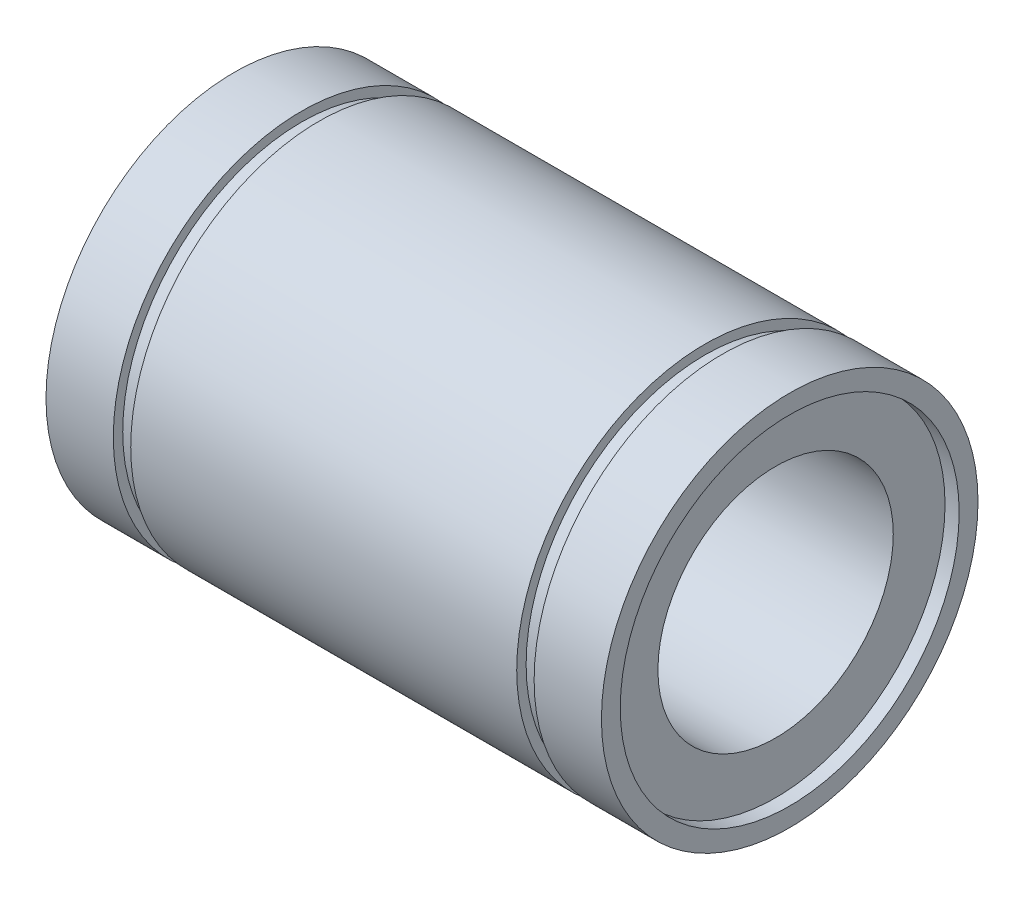
ISO-10303-21;
HEADER;
FILE_DESCRIPTION(('STEP AP214'),'2;1');
FILE_NAME('part.step','',(''),(''),'','','');
FILE_SCHEMA(('AUTOMOTIVE_DESIGN { 1 0 10303 214 1 1 1 1 }'));
ENDSEC;
DATA;
#1=APPLICATION_CONTEXT('core data for automotive mechanical design processes');
#2=APPLICATION_PROTOCOL_DEFINITION('international standard','automotive_design',2000,#1);
#3=PRODUCT_CONTEXT('',#1,'mechanical');
#4=PRODUCT('Part','Part','',(#3));
#5=PRODUCT_RELATED_PRODUCT_CATEGORY('part','',(#4));
#6=PRODUCT_DEFINITION_FORMATION('','',#4);
#7=PRODUCT_DEFINITION_CONTEXT('part definition',#1,'design');
#8=PRODUCT_DEFINITION('design','',#6,#7);
#9=PRODUCT_DEFINITION_SHAPE('','',#8);
#10=(LENGTH_UNIT() NAMED_UNIT(*) SI_UNIT(.MILLI.,.METRE.));
#11=(NAMED_UNIT(*) PLANE_ANGLE_UNIT() SI_UNIT($,.RADIAN.));
#12=(NAMED_UNIT(*) SI_UNIT($,.STERADIAN.) SOLID_ANGLE_UNIT());
#13=UNCERTAINTY_MEASURE_WITH_UNIT(LENGTH_MEASURE(1.E-05),#10,'distance_accuracy_value','');
#14=(GEOMETRIC_REPRESENTATION_CONTEXT(3) GLOBAL_UNCERTAINTY_ASSIGNED_CONTEXT((#13)) GLOBAL_UNIT_ASSIGNED_CONTEXT((#10,
#11,#12)) REPRESENTATION_CONTEXT('',''));
#15=CARTESIAN_POINT('',(0.,0.,0.));
#16=DIRECTION('',(0.,0.,1.));
#17=DIRECTION('',(1.,0.,0.));
#18=AXIS2_PLACEMENT_3D('',#15,#16,#17);
#19=CARTESIAN_POINT('',(22.35,19.,0.));
#20=DIRECTION('',(-1.,0.,0.));
#21=DIRECTION('',(0.,0.,1.));
#22=AXIS2_PLACEMENT_3D('',#19,#20,#21);
#23=PLANE('',#22);
#24=CARTESIAN_POINT('',(22.35,0.,0.));
#25=DIRECTION('',(-1.,0.,0.));
#26=DIRECTION('',(0.,0.,1.));
#27=AXIS2_PLACEMENT_3D('',#24,#25,#26);
#28=CIRCLE('',#27,20.);
#29=CARTESIAN_POINT('',(22.35,0.,20.));
#30=VERTEX_POINT('',#29);
#31=EDGE_CURVE('E10',#30,#30,#28,.T.);
#32=ORIENTED_EDGE('',*,*,#31,.T.);
#33=EDGE_LOOP('',(#32));
#34=FACE_BOUND('',#33,.T.);
#35=CARTESIAN_POINT('',(22.35,0.,0.));
#36=DIRECTION('',(-1.,0.,0.));
#37=DIRECTION('',(0.,0.,1.));
#38=AXIS2_PLACEMENT_3D('',#35,#36,#37);
#39=CIRCLE('',#38,19.);
#40=CARTESIAN_POINT('',(22.35,0.,19.));
#41=VERTEX_POINT('',#40);
#42=EDGE_CURVE('E106',#41,#41,#39,.T.);
#43=ORIENTED_EDGE('',*,*,#42,.F.);
#44=EDGE_LOOP('',(#43));
#45=FACE_BOUND('',#44,.T.);
#46=ADVANCED_FACE('F39',(#34,#45),#23,.T.);
#47=CARTESIAN_POINT('',(-34.3709464024891,0.,0.));
#48=DIRECTION('',(-1.,0.,0.));
#49=DIRECTION('',(0.,0.,1.));
#50=AXIS2_PLACEMENT_3D('',#47,#48,#49);
#51=CYLINDRICAL_SURFACE('',#50,20.);
#52=CARTESIAN_POINT('',(29.5,0.,0.));
#53=DIRECTION('',(-1.,0.,0.));
#54=DIRECTION('',(0.,0.,1.));
#55=AXIS2_PLACEMENT_3D('',#52,#53,#54);
#56=CIRCLE('',#55,20.);
#57=CARTESIAN_POINT('',(29.5,0.,20.));
#58=VERTEX_POINT('',#57);
#59=EDGE_CURVE('E46',#58,#58,#56,.T.);
#60=ORIENTED_EDGE('',*,*,#59,.T.);
#61=EDGE_LOOP('',(#60));
#62=FACE_BOUND('',#61,.T.);
#63=ORIENTED_EDGE('',*,*,#31,.F.);
#64=EDGE_LOOP('',(#63));
#65=FACE_BOUND('',#64,.T.);
#66=ADVANCED_FACE('F115',(#62,#65),#51,.T.);
#67=CARTESIAN_POINT('',(29.5,20.,0.));
#68=DIRECTION('',(1.,0.,0.));
#69=DIRECTION('',(0.,0.,-1.));
#70=AXIS2_PLACEMENT_3D('',#67,#68,#69);
#71=PLANE('',#70);
#72=CARTESIAN_POINT('',(29.5,0.,0.));
#73=DIRECTION('',(-1.,0.,0.));
#74=DIRECTION('',(0.,0.,1.));
#75=AXIS2_PLACEMENT_3D('',#72,#73,#74);
#76=CIRCLE('',#75,18.);
#77=CARTESIAN_POINT('',(29.5,0.,18.));
#78=VERTEX_POINT('',#77);
#79=EDGE_CURVE('E51',#78,#78,#76,.T.);
#80=ORIENTED_EDGE('',*,*,#79,.T.);
#81=EDGE_LOOP('',(#80));
#82=FACE_BOUND('',#81,.T.);
#83=ORIENTED_EDGE('',*,*,#59,.F.);
#84=EDGE_LOOP('',(#83));
#85=FACE_BOUND('',#84,.T.);
#86=ADVANCED_FACE('F119',(#82,#85),#71,.T.);
#87=CARTESIAN_POINT('',(-34.3709464024891,0.,0.));
#88=DIRECTION('',(-1.,0.,0.));
#89=DIRECTION('',(0.,0.,1.));
#90=AXIS2_PLACEMENT_3D('',#87,#88,#89);
#91=CYLINDRICAL_SURFACE('',#90,18.);
#92=CARTESIAN_POINT('',(28.,0.,0.));
#93=DIRECTION('',(-1.,0.,0.));
#94=DIRECTION('',(0.,0.,1.));
#95=AXIS2_PLACEMENT_3D('',#92,#93,#94);
#96=CIRCLE('',#95,18.);
#97=CARTESIAN_POINT('',(28.,0.,18.));
#98=VERTEX_POINT('',#97);
#99=EDGE_CURVE('E56',#98,#98,#96,.T.);
#100=ORIENTED_EDGE('',*,*,#99,.T.);
#101=EDGE_LOOP('',(#100));
#102=FACE_BOUND('',#101,.T.);
#103=ORIENTED_EDGE('',*,*,#79,.F.);
#104=EDGE_LOOP('',(#103));
#105=FACE_BOUND('',#104,.T.);
#106=ADVANCED_FACE('F123',(#102,#105),#91,.F.);
#107=CARTESIAN_POINT('',(28.,18.,0.));
#108=DIRECTION('',(1.,0.,0.));
#109=DIRECTION('',(0.,0.,-1.));
#110=AXIS2_PLACEMENT_3D('',#107,#108,#109);
#111=PLANE('',#110);
#112=CARTESIAN_POINT('',(28.,0.,0.));
#113=DIRECTION('',(-1.,0.,0.));
#114=DIRECTION('',(0.,0.,1.));
#115=AXIS2_PLACEMENT_3D('',#112,#113,#114);
#116=CIRCLE('',#115,12.5);
#117=CARTESIAN_POINT('',(28.,0.,12.5));
#118=VERTEX_POINT('',#117);
#119=EDGE_CURVE('E62',#118,#118,#116,.T.);
#120=ORIENTED_EDGE('',*,*,#119,.T.);
#121=EDGE_LOOP('',(#120));
#122=FACE_BOUND('',#121,.T.);
#123=ORIENTED_EDGE('',*,*,#99,.F.);
#124=EDGE_LOOP('',(#123));
#125=FACE_BOUND('',#124,.T.);
#126=ADVANCED_FACE('F130',(#122,#125),#111,.T.);
#127=CARTESIAN_POINT('',(-34.3709464024891,0.,0.));
#128=DIRECTION('',(-1.,0.,0.));
#129=DIRECTION('',(0.,0.,1.));
#130=AXIS2_PLACEMENT_3D('',#127,#128,#129);
#131=CYLINDRICAL_SURFACE('',#130,12.5);
#132=ORIENTED_EDGE('',*,*,#119,.F.);
#133=EDGE_LOOP('',(#132));
#134=FACE_BOUND('',#133,.T.);
#135=CARTESIAN_POINT('',(-28.,0.,0.));
#136=DIRECTION('',(-1.,0.,0.));
#137=DIRECTION('',(0.,0.,1.));
#138=AXIS2_PLACEMENT_3D('',#135,#136,#137);
#139=CIRCLE('',#138,12.5);
#140=CARTESIAN_POINT('',(-28.,0.,12.5));
#141=VERTEX_POINT('',#140);
#142=EDGE_CURVE('E66',#141,#141,#139,.T.);
#143=ORIENTED_EDGE('',*,*,#142,.T.);
#144=EDGE_LOOP('',(#143));
#145=FACE_BOUND('',#144,.T.);
#146=ADVANCED_FACE('F134',(#134,#145),#131,.F.);
#147=CARTESIAN_POINT('',(-28.,18.,0.));
#148=DIRECTION('',(1.,0.,0.));
#149=DIRECTION('',(0.,0.,-1.));
#150=AXIS2_PLACEMENT_3D('',#147,#148,#149);
#151=PLANE('',#150);
#152=ORIENTED_EDGE('',*,*,#142,.F.);
#153=EDGE_LOOP('',(#152));
#154=FACE_BOUND('',#153,.T.);
#155=CARTESIAN_POINT('',(-28.,0.,0.));
#156=DIRECTION('',(-1.,0.,0.));
#157=DIRECTION('',(0.,0.,1.));
#158=AXIS2_PLACEMENT_3D('',#155,#156,#157);
#159=CIRCLE('',#158,18.);
#160=CARTESIAN_POINT('',(-28.,0.,18.));
#161=VERTEX_POINT('',#160);
#162=EDGE_CURVE('E70',#161,#161,#159,.T.);
#163=ORIENTED_EDGE('',*,*,#162,.T.);
#164=EDGE_LOOP('',(#163));
#165=FACE_BOUND('',#164,.T.);
#166=ADVANCED_FACE('F138',(#154,#165),#151,.F.);
#167=CARTESIAN_POINT('',(-34.3709464024891,0.,0.));
#168=DIRECTION('',(-1.,0.,0.));
#169=DIRECTION('',(0.,0.,1.));
#170=AXIS2_PLACEMENT_3D('',#167,#168,#169);
#171=CYLINDRICAL_SURFACE('',#170,18.);
#172=ORIENTED_EDGE('',*,*,#162,.F.);
#173=EDGE_LOOP('',(#172));
#174=FACE_BOUND('',#173,.T.);
#175=CARTESIAN_POINT('',(-29.5,0.,0.));
#176=DIRECTION('',(-1.,0.,0.));
#177=DIRECTION('',(0.,0.,1.));
#178=AXIS2_PLACEMENT_3D('',#175,#176,#177);
#179=CIRCLE('',#178,18.);
#180=CARTESIAN_POINT('',(-29.5,0.,18.));
#181=VERTEX_POINT('',#180);
#182=EDGE_CURVE('E74',#181,#181,#179,.T.);
#183=ORIENTED_EDGE('',*,*,#182,.T.);
#184=EDGE_LOOP('',(#183));
#185=FACE_BOUND('',#184,.T.);
#186=ADVANCED_FACE('F142',(#174,#185),#171,.F.);
#187=CARTESIAN_POINT('',(-29.5,20.,0.));
#188=DIRECTION('',(1.,0.,0.));
#189=DIRECTION('',(0.,0.,-1.));
#190=AXIS2_PLACEMENT_3D('',#187,#188,#189);
#191=PLANE('',#190);
#192=ORIENTED_EDGE('',*,*,#182,.F.);
#193=EDGE_LOOP('',(#192));
#194=FACE_BOUND('',#193,.T.);
#195=CARTESIAN_POINT('',(-29.5,0.,0.));
#196=DIRECTION('',(-1.,0.,0.));
#197=DIRECTION('',(0.,0.,1.));
#198=AXIS2_PLACEMENT_3D('',#195,#196,#197);
#199=CIRCLE('',#198,20.);
#200=CARTESIAN_POINT('',(-29.5,0.,20.));
#201=VERTEX_POINT('',#200);
#202=EDGE_CURVE('E78',#201,#201,#199,.T.);
#203=ORIENTED_EDGE('',*,*,#202,.T.);
#204=EDGE_LOOP('',(#203));
#205=FACE_BOUND('',#204,.T.);
#206=ADVANCED_FACE('F146',(#194,#205),#191,.F.);
#207=CARTESIAN_POINT('',(-34.3709464024891,0.,0.));
#208=DIRECTION('',(-1.,0.,0.));
#209=DIRECTION('',(0.,0.,1.));
#210=AXIS2_PLACEMENT_3D('',#207,#208,#209);
#211=CYLINDRICAL_SURFACE('',#210,20.);
#212=ORIENTED_EDGE('',*,*,#202,.F.);
#213=EDGE_LOOP('',(#212));
#214=FACE_BOUND('',#213,.T.);
#215=CARTESIAN_POINT('',(-22.35,0.,0.));
#216=DIRECTION('',(-1.,0.,0.));
#217=DIRECTION('',(0.,0.,1.));
#218=AXIS2_PLACEMENT_3D('',#215,#216,#217);
#219=CIRCLE('',#218,20.);
#220=CARTESIAN_POINT('',(-22.35,0.,20.));
#221=VERTEX_POINT('',#220);
#222=EDGE_CURVE('E82',#221,#221,#219,.T.);
#223=ORIENTED_EDGE('',*,*,#222,.T.);
#224=EDGE_LOOP('',(#223));
#225=FACE_BOUND('',#224,.T.);
#226=ADVANCED_FACE('F150',(#214,#225),#211,.T.);
#227=CARTESIAN_POINT('',(-22.35,19.,0.));
#228=DIRECTION('',(-1.,0.,0.));
#229=DIRECTION('',(0.,0.,1.));
#230=AXIS2_PLACEMENT_3D('',#227,#228,#229);
#231=PLANE('',#230);
#232=ORIENTED_EDGE('',*,*,#222,.F.);
#233=EDGE_LOOP('',(#232));
#234=FACE_BOUND('',#233,.T.);
#235=CARTESIAN_POINT('',(-22.35,0.,0.));
#236=DIRECTION('',(-1.,0.,0.));
#237=DIRECTION('',(0.,0.,1.));
#238=AXIS2_PLACEMENT_3D('',#235,#236,#237);
#239=CIRCLE('',#238,19.);
#240=CARTESIAN_POINT('',(-22.35,0.,19.));
#241=VERTEX_POINT('',#240);
#242=EDGE_CURVE('E86',#241,#241,#239,.T.);
#243=ORIENTED_EDGE('',*,*,#242,.T.);
#244=EDGE_LOOP('',(#243));
#245=FACE_BOUND('',#244,.T.);
#246=ADVANCED_FACE('F154',(#234,#245),#231,.F.);
#247=CARTESIAN_POINT('',(-34.3709464024891,0.,0.));
#248=DIRECTION('',(-1.,0.,0.));
#249=DIRECTION('',(0.,0.,1.));
#250=AXIS2_PLACEMENT_3D('',#247,#248,#249);
#251=CYLINDRICAL_SURFACE('',#250,19.);
#252=ORIENTED_EDGE('',*,*,#242,.F.);
#253=EDGE_LOOP('',(#252));
#254=FACE_BOUND('',#253,.T.);
#255=CARTESIAN_POINT('',(-20.5,0.,0.));
#256=DIRECTION('',(-1.,0.,0.));
#257=DIRECTION('',(0.,0.,1.));
#258=AXIS2_PLACEMENT_3D('',#255,#256,#257);
#259=CIRCLE('',#258,19.);
#260=CARTESIAN_POINT('',(-20.5,0.,19.));
#261=VERTEX_POINT('',#260);
#262=EDGE_CURVE('E90',#261,#261,#259,.T.);
#263=ORIENTED_EDGE('',*,*,#262,.T.);
#264=EDGE_LOOP('',(#263));
#265=FACE_BOUND('',#264,.T.);
#266=ADVANCED_FACE('F158',(#254,#265),#251,.T.);
#267=CARTESIAN_POINT('',(-20.5,20.,0.));
#268=DIRECTION('',(1.,0.,0.));
#269=DIRECTION('',(0.,0.,-1.));
#270=AXIS2_PLACEMENT_3D('',#267,#268,#269);
#271=PLANE('',#270);
#272=ORIENTED_EDGE('',*,*,#262,.F.);
#273=EDGE_LOOP('',(#272));
#274=FACE_BOUND('',#273,.T.);
#275=CARTESIAN_POINT('',(-20.5,0.,0.));
#276=DIRECTION('',(-1.,0.,0.));
#277=DIRECTION('',(0.,0.,1.));
#278=AXIS2_PLACEMENT_3D('',#275,#276,#277);
#279=CIRCLE('',#278,20.);
#280=CARTESIAN_POINT('',(-20.5,0.,20.));
#281=VERTEX_POINT('',#280);
#282=EDGE_CURVE('E94',#281,#281,#279,.T.);
#283=ORIENTED_EDGE('',*,*,#282,.T.);
#284=EDGE_LOOP('',(#283));
#285=FACE_BOUND('',#284,.T.);
#286=ADVANCED_FACE('F162',(#274,#285),#271,.F.);
#287=CARTESIAN_POINT('',(-34.3709464024891,0.,0.));
#288=DIRECTION('',(-1.,0.,0.));
#289=DIRECTION('',(0.,0.,1.));
#290=AXIS2_PLACEMENT_3D('',#287,#288,#289);
#291=CYLINDRICAL_SURFACE('',#290,20.);
#292=ORIENTED_EDGE('',*,*,#282,.F.);
#293=EDGE_LOOP('',(#292));
#294=FACE_BOUND('',#293,.T.);
#295=CARTESIAN_POINT('',(20.5,0.,0.));
#296=DIRECTION('',(-1.,0.,0.));
#297=DIRECTION('',(0.,0.,1.));
#298=AXIS2_PLACEMENT_3D('',#295,#296,#297);
#299=CIRCLE('',#298,20.);
#300=CARTESIAN_POINT('',(20.5,0.,20.));
#301=VERTEX_POINT('',#300);
#302=EDGE_CURVE('E98',#301,#301,#299,.T.);
#303=ORIENTED_EDGE('',*,*,#302,.T.);
#304=EDGE_LOOP('',(#303));
#305=FACE_BOUND('',#304,.T.);
#306=ADVANCED_FACE('F166',(#294,#305),#291,.T.);
#307=CARTESIAN_POINT('',(20.5,20.,0.));
#308=DIRECTION('',(1.,0.,0.));
#309=DIRECTION('',(0.,0.,-1.));
#310=AXIS2_PLACEMENT_3D('',#307,#308,#309);
#311=PLANE('',#310);
#312=CARTESIAN_POINT('',(20.5,0.,0.));
#313=DIRECTION('',(-1.,0.,0.));
#314=DIRECTION('',(0.,0.,1.));
#315=AXIS2_PLACEMENT_3D('',#312,#313,#314);
#316=CIRCLE('',#315,19.);
#317=CARTESIAN_POINT('',(20.5,0.,19.));
#318=VERTEX_POINT('',#317);
#319=EDGE_CURVE('E102',#318,#318,#316,.T.);
#320=ORIENTED_EDGE('',*,*,#319,.T.);
#321=EDGE_LOOP('',(#320));
#322=FACE_BOUND('',#321,.T.);
#323=ORIENTED_EDGE('',*,*,#302,.F.);
#324=EDGE_LOOP('',(#323));
#325=FACE_BOUND('',#324,.T.);
#326=ADVANCED_FACE('F170',(#322,#325),#311,.T.);
#327=CARTESIAN_POINT('',(-34.3709464024891,0.,0.));
#328=DIRECTION('',(-1.,0.,0.));
#329=DIRECTION('',(0.,0.,1.));
#330=AXIS2_PLACEMENT_3D('',#327,#328,#329);
#331=CYLINDRICAL_SURFACE('',#330,19.);
#332=ORIENTED_EDGE('',*,*,#42,.T.);
#333=EDGE_LOOP('',(#332));
#334=FACE_BOUND('',#333,.T.);
#335=ORIENTED_EDGE('',*,*,#319,.F.);
#336=EDGE_LOOP('',(#335));
#337=FACE_BOUND('',#336,.T.);
#338=ADVANCED_FACE('F111',(#334,#337),#331,.T.);
#339=CLOSED_SHELL('',(#46,#66,#86,#106,#126,#146,#166,#186,#206,#226,#246,#266,#286,#306,#326,#338));
#340=MANIFOLD_SOLID_BREP('B2',#339);
#341=ADVANCED_BREP_SHAPE_REPRESENTATION('',(#18,#340),#14);
#342=SHAPE_DEFINITION_REPRESENTATION(#9,#341);
ENDSEC;
END-ISO-10303-21;
